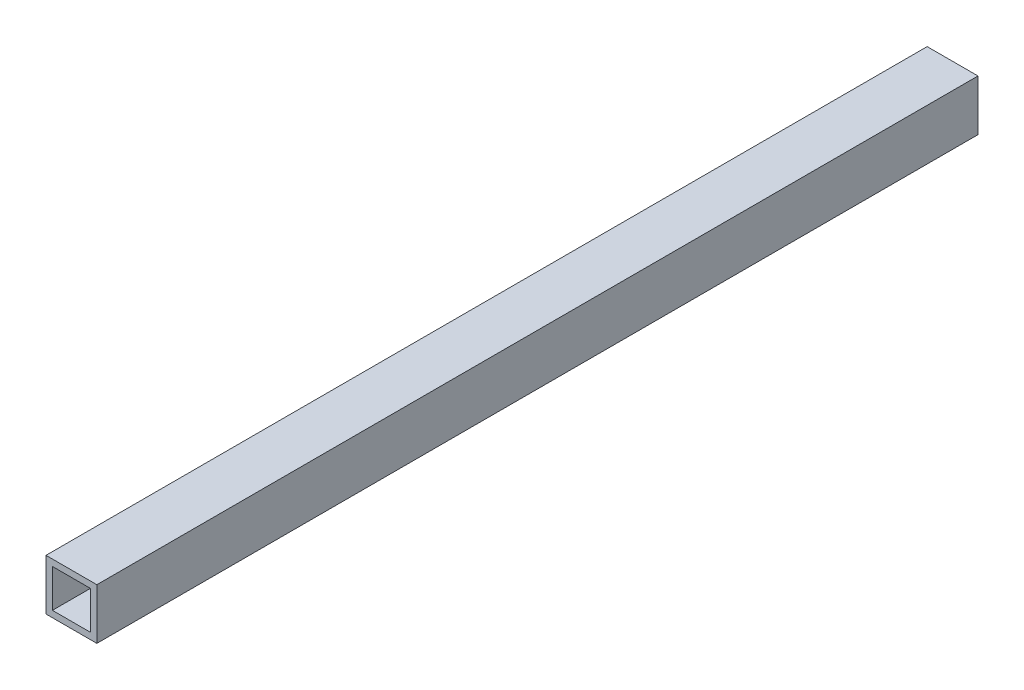
ISO-10303-21;
HEADER;
FILE_DESCRIPTION(('STEP AP214'),'2;1');
FILE_NAME('part.step','',(''),(''),'','','');
FILE_SCHEMA(('AUTOMOTIVE_DESIGN { 1 0 10303 214 1 1 1 1 }'));
ENDSEC;
DATA;
#1=APPLICATION_CONTEXT('core data for automotive mechanical design processes');
#2=APPLICATION_PROTOCOL_DEFINITION('international standard','automotive_design',2000,#1);
#3=PRODUCT_CONTEXT('',#1,'mechanical');
#4=PRODUCT('Part','Part','',(#3));
#5=PRODUCT_RELATED_PRODUCT_CATEGORY('part','',(#4));
#6=PRODUCT_DEFINITION_FORMATION('','',#4);
#7=PRODUCT_DEFINITION_CONTEXT('part definition',#1,'design');
#8=PRODUCT_DEFINITION('design','',#6,#7);
#9=PRODUCT_DEFINITION_SHAPE('','',#8);
#10=(LENGTH_UNIT() NAMED_UNIT(*) SI_UNIT(.MILLI.,.METRE.));
#11=(NAMED_UNIT(*) PLANE_ANGLE_UNIT() SI_UNIT($,.RADIAN.));
#12=(NAMED_UNIT(*) SI_UNIT($,.STERADIAN.) SOLID_ANGLE_UNIT());
#13=UNCERTAINTY_MEASURE_WITH_UNIT(LENGTH_MEASURE(1.E-05),#10,'distance_accuracy_value','');
#14=(GEOMETRIC_REPRESENTATION_CONTEXT(3) GLOBAL_UNCERTAINTY_ASSIGNED_CONTEXT((#13)) GLOBAL_UNIT_ASSIGNED_CONTEXT((#10,
#11,#12)) REPRESENTATION_CONTEXT('',''));
#15=CARTESIAN_POINT('',(0.,0.,0.));
#16=DIRECTION('',(0.,0.,1.));
#17=DIRECTION('',(1.,0.,0.));
#18=AXIS2_PLACEMENT_3D('',#15,#16,#17);
#19=CARTESIAN_POINT('',(0.,0.,105.));
#20=DIRECTION('',(0.,0.,1.));
#21=DIRECTION('',(1.,0.,0.));
#22=AXIS2_PLACEMENT_3D('',#19,#20,#21);
#23=PLANE('',#22);
#24=DIRECTION('',(0.,1.,0.));
#25=VECTOR('',#24,1.);
#26=CARTESIAN_POINT('',(6.06,6.06,105.));
#27=LINE('',#26,#25);
#28=CARTESIAN_POINT('',(6.06,-6.06,105.));
#29=VERTEX_POINT('',#28);
#30=CARTESIAN_POINT('',(6.06,6.06,105.));
#31=VERTEX_POINT('',#30);
#32=EDGE_CURVE('E153',#29,#31,#27,.T.);
#33=ORIENTED_EDGE('',*,*,#32,.T.);
#34=DIRECTION('',(-1.,0.,0.));
#35=VECTOR('',#34,1.);
#36=CARTESIAN_POINT('',(-6.06,6.06,105.));
#37=LINE('',#36,#35);
#38=CARTESIAN_POINT('',(-6.06,6.06,105.));
#39=VERTEX_POINT('',#38);
#40=EDGE_CURVE('E157',#31,#39,#37,.T.);
#41=ORIENTED_EDGE('',*,*,#40,.T.);
#42=DIRECTION('',(0.,-1.,0.));
#43=VECTOR('',#42,1.);
#44=CARTESIAN_POINT('',(-6.06,6.06,105.));
#45=LINE('',#44,#43);
#46=CARTESIAN_POINT('',(-6.06,-6.06,105.));
#47=VERTEX_POINT('',#46);
#48=EDGE_CURVE('E161',#39,#47,#45,.T.);
#49=ORIENTED_EDGE('',*,*,#48,.T.);
#50=DIRECTION('',(1.,0.,0.));
#51=VECTOR('',#50,1.);
#52=CARTESIAN_POINT('',(-6.06,-6.06,105.));
#53=LINE('',#52,#51);
#54=EDGE_CURVE('E164',#47,#29,#53,.T.);
#55=ORIENTED_EDGE('',*,*,#54,.T.);
#56=EDGE_LOOP('',(#33,#41,#49,#55));
#57=FACE_BOUND('',#56,.T.);
#58=DIRECTION('',(-1.,0.,0.));
#59=VECTOR('',#58,1.);
#60=CARTESIAN_POINT('',(-4.53,4.53,105.));
#61=LINE('',#60,#59);
#62=CARTESIAN_POINT('',(4.53,4.53,105.));
#63=VERTEX_POINT('',#62);
#64=CARTESIAN_POINT('',(-4.53,4.53,105.));
#65=VERTEX_POINT('',#64);
#66=EDGE_CURVE('E114',#63,#65,#61,.T.);
#67=ORIENTED_EDGE('',*,*,#66,.F.);
#68=DIRECTION('',(0.,1.,0.));
#69=VECTOR('',#68,1.);
#70=CARTESIAN_POINT('',(4.53,4.53,105.));
#71=LINE('',#70,#69);
#72=CARTESIAN_POINT('',(4.53,-4.53,105.));
#73=VERTEX_POINT('',#72);
#74=EDGE_CURVE('E105',#73,#63,#71,.T.);
#75=ORIENTED_EDGE('',*,*,#74,.F.);
#76=DIRECTION('',(1.,0.,0.));
#77=VECTOR('',#76,1.);
#78=CARTESIAN_POINT('',(-4.53,-4.53,105.));
#79=LINE('',#78,#77);
#80=CARTESIAN_POINT('',(-4.53,-4.53,105.));
#81=VERTEX_POINT('',#80);
#82=EDGE_CURVE('E131',#81,#73,#79,.T.);
#83=ORIENTED_EDGE('',*,*,#82,.F.);
#84=DIRECTION('',(0.,-1.,0.));
#85=VECTOR('',#84,1.);
#86=CARTESIAN_POINT('',(-4.53,4.53,105.));
#87=LINE('',#86,#85);
#88=EDGE_CURVE('E127',#65,#81,#87,.T.);
#89=ORIENTED_EDGE('',*,*,#88,.F.);
#90=EDGE_LOOP('',(#67,#75,#83,#89));
#91=FACE_BOUND('',#90,.T.);
#92=ADVANCED_FACE('F39',(#57,#91),#23,.T.);
#93=CARTESIAN_POINT('',(0.,0.,-105.));
#94=DIRECTION('',(0.,0.,1.));
#95=DIRECTION('',(1.,0.,0.));
#96=AXIS2_PLACEMENT_3D('',#93,#94,#95);
#97=PLANE('',#96);
#98=DIRECTION('',(0.,1.,0.));
#99=VECTOR('',#98,1.);
#100=CARTESIAN_POINT('',(6.06,6.06,-105.));
#101=LINE('',#100,#99);
#102=CARTESIAN_POINT('',(6.06,-6.06,-105.));
#103=VERTEX_POINT('',#102);
#104=CARTESIAN_POINT('',(6.06,6.06,-105.));
#105=VERTEX_POINT('',#104);
#106=EDGE_CURVE('E123',#103,#105,#101,.T.);
#107=ORIENTED_EDGE('',*,*,#106,.F.);
#108=DIRECTION('',(1.,0.,0.));
#109=VECTOR('',#108,1.);
#110=CARTESIAN_POINT('',(-6.06,-6.06,-105.));
#111=LINE('',#110,#109);
#112=CARTESIAN_POINT('',(-6.06,-6.06,-105.));
#113=VERTEX_POINT('',#112);
#114=EDGE_CURVE('E158',#113,#103,#111,.T.);
#115=ORIENTED_EDGE('',*,*,#114,.F.);
#116=DIRECTION('',(0.,-1.,0.));
#117=VECTOR('',#116,1.);
#118=CARTESIAN_POINT('',(-6.06,6.06,-105.));
#119=LINE('',#118,#117);
#120=CARTESIAN_POINT('',(-6.06,6.06,-105.));
#121=VERTEX_POINT('',#120);
#122=EDGE_CURVE('E174',#121,#113,#119,.T.);
#123=ORIENTED_EDGE('',*,*,#122,.F.);
#124=DIRECTION('',(-1.,0.,0.));
#125=VECTOR('',#124,1.);
#126=CARTESIAN_POINT('',(-6.06,6.06,-105.));
#127=LINE('',#126,#125);
#128=EDGE_CURVE('E171',#105,#121,#127,.T.);
#129=ORIENTED_EDGE('',*,*,#128,.F.);
#130=EDGE_LOOP('',(#107,#115,#123,#129));
#131=FACE_BOUND('',#130,.T.);
#132=DIRECTION('',(0.,1.,0.));
#133=VECTOR('',#132,1.);
#134=CARTESIAN_POINT('',(4.53,4.53,-105.));
#135=LINE('',#134,#133);
#136=CARTESIAN_POINT('',(4.53,-4.53,-105.));
#137=VERTEX_POINT('',#136);
#138=CARTESIAN_POINT('',(4.53,4.53,-105.));
#139=VERTEX_POINT('',#138);
#140=EDGE_CURVE('E63',#137,#139,#135,.T.);
#141=ORIENTED_EDGE('',*,*,#140,.T.);
#142=DIRECTION('',(-1.,0.,0.));
#143=VECTOR('',#142,1.);
#144=CARTESIAN_POINT('',(-4.53,4.53,-105.));
#145=LINE('',#144,#143);
#146=CARTESIAN_POINT('',(-4.53,4.53,-105.));
#147=VERTEX_POINT('',#146);
#148=EDGE_CURVE('E121',#139,#147,#145,.T.);
#149=ORIENTED_EDGE('',*,*,#148,.T.);
#150=DIRECTION('',(0.,-1.,0.));
#151=VECTOR('',#150,1.);
#152=CARTESIAN_POINT('',(-4.53,4.53,-105.));
#153=LINE('',#152,#151);
#154=CARTESIAN_POINT('',(-4.53,-4.53,-105.));
#155=VERTEX_POINT('',#154);
#156=EDGE_CURVE('E140',#147,#155,#153,.T.);
#157=ORIENTED_EDGE('',*,*,#156,.T.);
#158=DIRECTION('',(1.,0.,0.));
#159=VECTOR('',#158,1.);
#160=CARTESIAN_POINT('',(-4.53,-4.53,-105.));
#161=LINE('',#160,#159);
#162=EDGE_CURVE('E115',#155,#137,#161,.T.);
#163=ORIENTED_EDGE('',*,*,#162,.T.);
#164=EDGE_LOOP('',(#141,#149,#157,#163));
#165=FACE_BOUND('',#164,.T.);
#166=ADVANCED_FACE('F197',(#131,#165),#97,.F.);
#167=CARTESIAN_POINT('',(6.06,6.06,105.));
#168=DIRECTION('',(-1.,0.,0.));
#169=DIRECTION('',(0.,0.,1.));
#170=AXIS2_PLACEMENT_3D('',#167,#168,#169);
#171=PLANE('',#170);
#172=ORIENTED_EDGE('',*,*,#106,.T.);
#173=DIRECTION('',(0.,0.,-1.));
#174=VECTOR('',#173,1.);
#175=CARTESIAN_POINT('',(6.06,6.06,105.));
#176=LINE('',#175,#174);
#177=EDGE_CURVE('E11',#31,#105,#176,.T.);
#178=ORIENTED_EDGE('',*,*,#177,.F.);
#179=ORIENTED_EDGE('',*,*,#32,.F.);
#180=DIRECTION('',(0.,0.,-1.));
#181=VECTOR('',#180,1.);
#182=CARTESIAN_POINT('',(6.06,-6.06,105.));
#183=LINE('',#182,#181);
#184=EDGE_CURVE('E167',#29,#103,#183,.T.);
#185=ORIENTED_EDGE('',*,*,#184,.T.);
#186=EDGE_LOOP('',(#172,#178,#179,#185));
#187=FACE_BOUND('',#186,.T.);
#188=ADVANCED_FACE('F41',(#187),#171,.F.);
#189=CARTESIAN_POINT('',(-6.06,6.06,105.));
#190=DIRECTION('',(0.,-1.,0.));
#191=DIRECTION('',(0.,0.,-1.));
#192=AXIS2_PLACEMENT_3D('',#189,#190,#191);
#193=PLANE('',#192);
#194=ORIENTED_EDGE('',*,*,#128,.T.);
#195=DIRECTION('',(0.,0.,-1.));
#196=VECTOR('',#195,1.);
#197=CARTESIAN_POINT('',(-6.06,6.06,105.));
#198=LINE('',#197,#196);
#199=EDGE_CURVE('E48',#39,#121,#198,.T.);
#200=ORIENTED_EDGE('',*,*,#199,.F.);
#201=ORIENTED_EDGE('',*,*,#40,.F.);
#202=ORIENTED_EDGE('',*,*,#177,.T.);
#203=EDGE_LOOP('',(#194,#200,#201,#202));
#204=FACE_BOUND('',#203,.T.);
#205=ADVANCED_FACE('F207',(#204),#193,.F.);
#206=CARTESIAN_POINT('',(-6.06,6.06,105.));
#207=DIRECTION('',(1.,0.,0.));
#208=DIRECTION('',(0.,0.,-1.));
#209=AXIS2_PLACEMENT_3D('',#206,#207,#208);
#210=PLANE('',#209);
#211=ORIENTED_EDGE('',*,*,#122,.T.);
#212=DIRECTION('',(0.,0.,-1.));
#213=VECTOR('',#212,1.);
#214=CARTESIAN_POINT('',(-6.06,-6.06,105.));
#215=LINE('',#214,#213);
#216=EDGE_CURVE('E182',#47,#113,#215,.T.);
#217=ORIENTED_EDGE('',*,*,#216,.F.);
#218=ORIENTED_EDGE('',*,*,#48,.F.);
#219=ORIENTED_EDGE('',*,*,#199,.T.);
#220=EDGE_LOOP('',(#211,#217,#218,#219));
#221=FACE_BOUND('',#220,.T.);
#222=ADVANCED_FACE('F191',(#221),#210,.F.);
#223=CARTESIAN_POINT('',(-6.06,-6.06,105.));
#224=DIRECTION('',(0.,1.,0.));
#225=DIRECTION('',(0.,0.,1.));
#226=AXIS2_PLACEMENT_3D('',#223,#224,#225);
#227=PLANE('',#226);
#228=ORIENTED_EDGE('',*,*,#114,.T.);
#229=ORIENTED_EDGE('',*,*,#184,.F.);
#230=ORIENTED_EDGE('',*,*,#54,.F.);
#231=ORIENTED_EDGE('',*,*,#216,.T.);
#232=EDGE_LOOP('',(#228,#229,#230,#231));
#233=FACE_BOUND('',#232,.T.);
#234=ADVANCED_FACE('F201',(#233),#227,.F.);
#235=CARTESIAN_POINT('',(4.53,4.53,105.));
#236=DIRECTION('',(-1.,0.,0.));
#237=DIRECTION('',(0.,0.,1.));
#238=AXIS2_PLACEMENT_3D('',#235,#236,#237);
#239=PLANE('',#238);
#240=ORIENTED_EDGE('',*,*,#140,.F.);
#241=DIRECTION('',(0.,0.,-1.));
#242=VECTOR('',#241,1.);
#243=CARTESIAN_POINT('',(4.53,-4.53,105.));
#244=LINE('',#243,#242);
#245=EDGE_CURVE('E109',#73,#137,#244,.T.);
#246=ORIENTED_EDGE('',*,*,#245,.F.);
#247=ORIENTED_EDGE('',*,*,#74,.T.);
#248=DIRECTION('',(0.,0.,-1.));
#249=VECTOR('',#248,1.);
#250=CARTESIAN_POINT('',(4.53,4.53,105.));
#251=LINE('',#250,#249);
#252=EDGE_CURVE('E108',#63,#139,#251,.T.);
#253=ORIENTED_EDGE('',*,*,#252,.T.);
#254=EDGE_LOOP('',(#240,#246,#247,#253));
#255=FACE_BOUND('',#254,.T.);
#256=ADVANCED_FACE('F107',(#255),#239,.T.);
#257=CARTESIAN_POINT('',(-4.53,4.53,105.));
#258=DIRECTION('',(0.,-1.,0.));
#259=DIRECTION('',(0.,0.,-1.));
#260=AXIS2_PLACEMENT_3D('',#257,#258,#259);
#261=PLANE('',#260);
#262=ORIENTED_EDGE('',*,*,#148,.F.);
#263=ORIENTED_EDGE('',*,*,#252,.F.);
#264=ORIENTED_EDGE('',*,*,#66,.T.);
#265=DIRECTION('',(0.,0.,-1.));
#266=VECTOR('',#265,1.);
#267=CARTESIAN_POINT('',(-4.53,4.53,105.));
#268=LINE('',#267,#266);
#269=EDGE_CURVE('E124',#65,#147,#268,.T.);
#270=ORIENTED_EDGE('',*,*,#269,.T.);
#271=EDGE_LOOP('',(#262,#263,#264,#270));
#272=FACE_BOUND('',#271,.T.);
#273=ADVANCED_FACE('F118',(#272),#261,.T.);
#274=CARTESIAN_POINT('',(-4.53,4.53,105.));
#275=DIRECTION('',(1.,0.,0.));
#276=DIRECTION('',(0.,0.,-1.));
#277=AXIS2_PLACEMENT_3D('',#274,#275,#276);
#278=PLANE('',#277);
#279=ORIENTED_EDGE('',*,*,#156,.F.);
#280=ORIENTED_EDGE('',*,*,#269,.F.);
#281=ORIENTED_EDGE('',*,*,#88,.T.);
#282=DIRECTION('',(0.,0.,-1.));
#283=VECTOR('',#282,1.);
#284=CARTESIAN_POINT('',(-4.53,-4.53,105.));
#285=LINE('',#284,#283);
#286=EDGE_CURVE('E55',#81,#155,#285,.T.);
#287=ORIENTED_EDGE('',*,*,#286,.T.);
#288=EDGE_LOOP('',(#279,#280,#281,#287));
#289=FACE_BOUND('',#288,.T.);
#290=ADVANCED_FACE('F230',(#289),#278,.T.);
#291=CARTESIAN_POINT('',(-4.53,-4.53,105.));
#292=DIRECTION('',(0.,1.,0.));
#293=DIRECTION('',(0.,0.,1.));
#294=AXIS2_PLACEMENT_3D('',#291,#292,#293);
#295=PLANE('',#294);
#296=ORIENTED_EDGE('',*,*,#162,.F.);
#297=ORIENTED_EDGE('',*,*,#286,.F.);
#298=ORIENTED_EDGE('',*,*,#82,.T.);
#299=ORIENTED_EDGE('',*,*,#245,.T.);
#300=EDGE_LOOP('',(#296,#297,#298,#299));
#301=FACE_BOUND('',#300,.T.);
#302=ADVANCED_FACE('F234',(#301),#295,.T.);
#303=CLOSED_SHELL('',(#92,#166,#188,#205,#222,#234,#256,#273,#290,#302));
#304=MANIFOLD_SOLID_BREP('B2',#303);
#305=ADVANCED_BREP_SHAPE_REPRESENTATION('',(#18,#304),#14);
#306=SHAPE_DEFINITION_REPRESENTATION(#9,#305);
ENDSEC;
END-ISO-10303-21;
